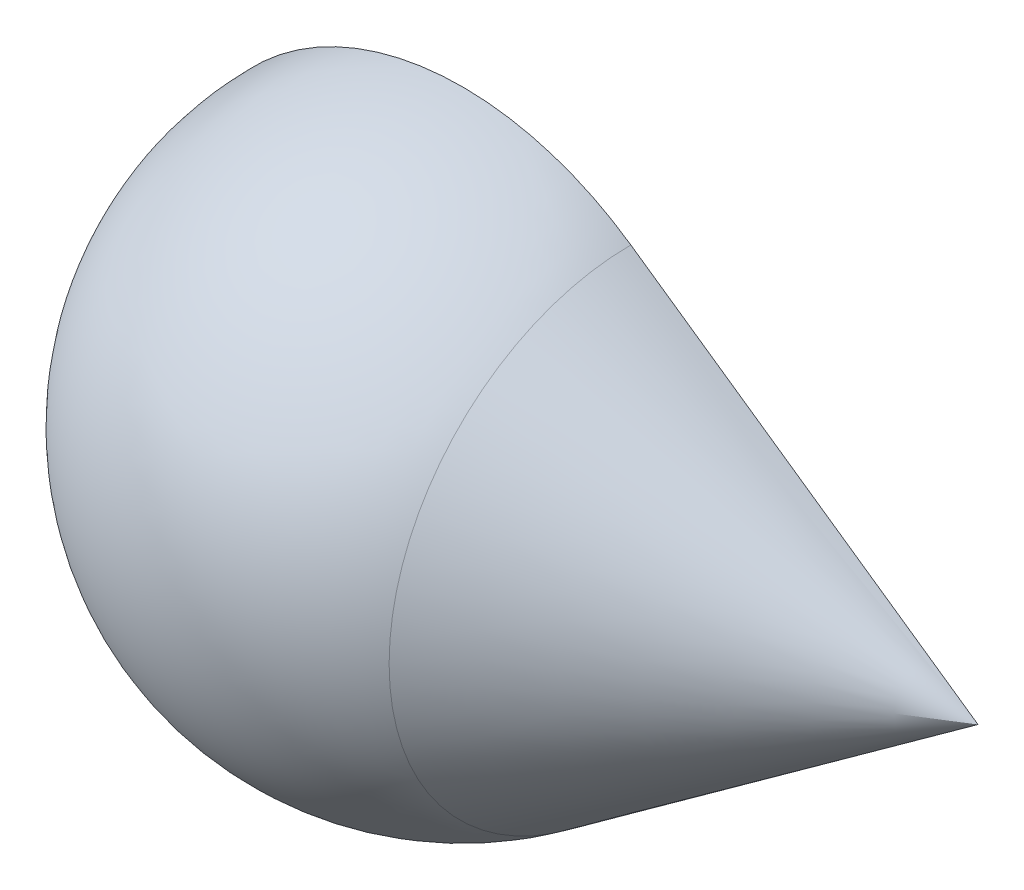
ISO-10303-21;
HEADER;
FILE_DESCRIPTION(('STEP AP214'),'2;1');
FILE_NAME('part.step','',(''),(''),'','','');
FILE_SCHEMA(('AUTOMOTIVE_DESIGN { 1 0 10303 214 1 1 1 1 }'));
ENDSEC;
DATA;
#1=APPLICATION_CONTEXT('core data for automotive mechanical design processes');
#2=APPLICATION_PROTOCOL_DEFINITION('international standard','automotive_design',2000,#1);
#3=PRODUCT_CONTEXT('',#1,'mechanical');
#4=PRODUCT('Part','Part','',(#3));
#5=PRODUCT_RELATED_PRODUCT_CATEGORY('part','',(#4));
#6=PRODUCT_DEFINITION_FORMATION('','',#4);
#7=PRODUCT_DEFINITION_CONTEXT('part definition',#1,'design');
#8=PRODUCT_DEFINITION('design','',#6,#7);
#9=PRODUCT_DEFINITION_SHAPE('','',#8);
#10=(LENGTH_UNIT() NAMED_UNIT(*) SI_UNIT(.MILLI.,.METRE.));
#11=(NAMED_UNIT(*) PLANE_ANGLE_UNIT() SI_UNIT($,.RADIAN.));
#12=(NAMED_UNIT(*) SI_UNIT($,.STERADIAN.) SOLID_ANGLE_UNIT());
#13=UNCERTAINTY_MEASURE_WITH_UNIT(LENGTH_MEASURE(1.E-05),#10,'distance_accuracy_value','');
#14=(GEOMETRIC_REPRESENTATION_CONTEXT(3) GLOBAL_UNCERTAINTY_ASSIGNED_CONTEXT((#13)) GLOBAL_UNIT_ASSIGNED_CONTEXT((#10,
#11,#12)) REPRESENTATION_CONTEXT('',''));
#15=CARTESIAN_POINT('',(0.,0.,0.));
#16=DIRECTION('',(0.,0.,1.));
#17=DIRECTION('',(1.,0.,0.));
#18=AXIS2_PLACEMENT_3D('',#15,#16,#17);
#19=CARTESIAN_POINT('',(70.,0.,0.));
#20=DIRECTION('',(-1.,0.,0.));
#21=DIRECTION('',(0.,0.,1.));
#22=AXIS2_PLACEMENT_3D('',#19,#20,#21);
#23=CONICAL_SURFACE('',#22,0.,0.608245578910209);
#24=CARTESIAN_POINT('',(22.8571428571429,0.,0.));
#25=DIRECTION('',(-1.,0.,0.));
#26=DIRECTION('',(0.,0.,1.));
#27=AXIS2_PLACEMENT_3D('',#24,#25,#26);
#28=CIRCLE('',#27,32.8260722659316);
#29=CARTESIAN_POINT('',(22.8571428571429,-32.8260722659316,-2.29223237488032E-13));
#30=VERTEX_POINT('',#29);
#31=CARTESIAN_POINT('',(22.8571428571429,32.8260722659316,0.));
#32=VERTEX_POINT('',#31);
#33=EDGE_CURVE('E11',#30,#32,#28,.T.);
#34=ORIENTED_EDGE('',*,*,#33,.F.);
#35=DIRECTION('',(-0.82065180664829,-0.571428571428571,0.));
#36=VECTOR('',#35,1.);
#37=CARTESIAN_POINT('',(22.8571428571428,-32.8260722659316,-2.29223237488033E-13));
#38=LINE('',#37,#36);
#39=CARTESIAN_POINT('',(70.,0.,0.));
#40=VERTEX_POINT('',#39);
#41=EDGE_CURVE('E62',#40,#30,#38,.T.);
#42=ORIENTED_EDGE('',*,*,#41,.F.);
#43=DIRECTION('',(-0.82065180664829,0.571428571428571,0.));
#44=VECTOR('',#43,1.);
#45=CARTESIAN_POINT('',(22.8571428571428,32.8260722659316,0.));
#46=LINE('',#45,#44);
#47=EDGE_CURVE('E54',#40,#32,#46,.T.);
#48=ORIENTED_EDGE('',*,*,#47,.T.);
#49=EDGE_LOOP('',(#34,#42,#48));
#50=FACE_BOUND('',#49,.T.);
#51=ADVANCED_FACE('F39',(#50),#23,.T.);
#52=CARTESIAN_POINT('',(0.,0.,0.));
#53=DIRECTION('',(-1.,0.,0.));
#54=DIRECTION('',(0.,-1.,0.));
#55=AXIS2_PLACEMENT_3D('',#52,#53,#54);
#56=SPHERICAL_SURFACE('',#55,40.);
#57=ORIENTED_EDGE('',*,*,#33,.T.);
#58=CARTESIAN_POINT('',(0.,0.,0.));
#59=DIRECTION('',(0.,0.,-1.));
#60=DIRECTION('',(1.,0.,0.));
#61=AXIS2_PLACEMENT_3D('',#58,#59,#60);
#62=CIRCLE('',#61,40.);
#63=EDGE_CURVE('E47',#30,#32,#62,.T.);
#64=ORIENTED_EDGE('',*,*,#63,.F.);
#65=EDGE_LOOP('',(#57,#64));
#66=FACE_BOUND('',#65,.T.);
#67=ADVANCED_FACE('F41',(#66),#56,.T.);
#68=CARTESIAN_POINT('',(0.,0.,0.));
#69=DIRECTION('',(0.,0.,-1.));
#70=DIRECTION('',(1.,0.,0.));
#71=AXIS2_PLACEMENT_3D('',#68,#69,#70);
#72=PLANE('',#71);
#73=ORIENTED_EDGE('',*,*,#41,.T.);
#74=ORIENTED_EDGE('',*,*,#63,.T.);
#75=ORIENTED_EDGE('',*,*,#47,.F.);
#76=EDGE_LOOP('',(#73,#74,#75));
#77=FACE_BOUND('',#76,.T.);
#78=ADVANCED_FACE('F61',(#77),#72,.T.);
#79=CLOSED_SHELL('',(#51,#67,#78));
#80=MANIFOLD_SOLID_BREP('B2',#79);
#81=ADVANCED_BREP_SHAPE_REPRESENTATION('',(#18,#80),#14);
#82=SHAPE_DEFINITION_REPRESENTATION(#9,#81);
ENDSEC;
END-ISO-10303-21;
